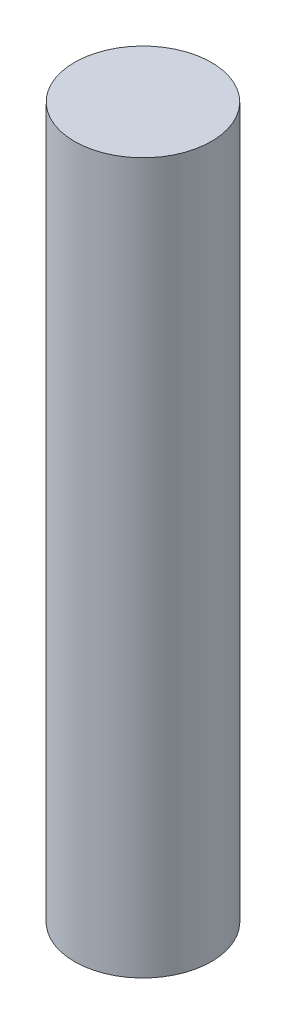
ISO-10303-21;
HEADER;
FILE_DESCRIPTION(('STEP AP214'),'2;1');
FILE_NAME('part.step','',(''),(''),'','','');
FILE_SCHEMA(('AUTOMOTIVE_DESIGN { 1 0 10303 214 1 1 1 1 }'));
ENDSEC;
DATA;
#1=APPLICATION_CONTEXT('core data for automotive mechanical design processes');
#2=APPLICATION_PROTOCOL_DEFINITION('international standard','automotive_design',2000,#1);
#3=PRODUCT_CONTEXT('',#1,'mechanical');
#4=PRODUCT('Part','Part','',(#3));
#5=PRODUCT_RELATED_PRODUCT_CATEGORY('part','',(#4));
#6=PRODUCT_DEFINITION_FORMATION('','',#4);
#7=PRODUCT_DEFINITION_CONTEXT('part definition',#1,'design');
#8=PRODUCT_DEFINITION('design','',#6,#7);
#9=PRODUCT_DEFINITION_SHAPE('','',#8);
#10=(LENGTH_UNIT() NAMED_UNIT(*) SI_UNIT(.MILLI.,.METRE.));
#11=(NAMED_UNIT(*) PLANE_ANGLE_UNIT() SI_UNIT($,.RADIAN.));
#12=(NAMED_UNIT(*) SI_UNIT($,.STERADIAN.) SOLID_ANGLE_UNIT());
#13=UNCERTAINTY_MEASURE_WITH_UNIT(LENGTH_MEASURE(1.E-05),#10,'distance_accuracy_value','');
#14=(GEOMETRIC_REPRESENTATION_CONTEXT(3) GLOBAL_UNCERTAINTY_ASSIGNED_CONTEXT((#13)) GLOBAL_UNIT_ASSIGNED_CONTEXT((#10,
#11,#12)) REPRESENTATION_CONTEXT('',''));
#15=CARTESIAN_POINT('',(0.,0.,0.));
#16=DIRECTION('',(0.,0.,1.));
#17=DIRECTION('',(1.,0.,0.));
#18=AXIS2_PLACEMENT_3D('',#15,#16,#17);
#19=CARTESIAN_POINT('',(0.,51.880000126,0.));
#20=DIRECTION('',(0.,-1.,0.));
#21=DIRECTION('',(0.,0.,-1.));
#22=AXIS2_PLACEMENT_3D('',#19,#20,#21);
#23=CYLINDRICAL_SURFACE('',#22,5.000000033);
#24=CARTESIAN_POINT('',(0.,51.880000126,0.));
#25=DIRECTION('',(0.,1.,0.));
#26=DIRECTION('',(0.,0.,1.));
#27=AXIS2_PLACEMENT_3D('',#24,#25,#26);
#28=CIRCLE('',#27,5.000000033);
#29=CARTESIAN_POINT('',(0.,51.880000126,5.000000033));
#30=VERTEX_POINT('',#29);
#31=EDGE_CURVE('E10',#30,#30,#28,.T.);
#32=ORIENTED_EDGE('',*,*,#31,.F.);
#33=EDGE_LOOP('',(#32));
#34=FACE_BOUND('',#33,.T.);
#35=CARTESIAN_POINT('',(0.,0.,0.));
#36=DIRECTION('',(0.,1.,0.));
#37=DIRECTION('',(0.,0.,1.));
#38=AXIS2_PLACEMENT_3D('',#35,#36,#37);
#39=CIRCLE('',#38,5.000000033);
#40=CARTESIAN_POINT('',(0.,0.,5.000000033));
#41=VERTEX_POINT('',#40);
#42=EDGE_CURVE('E37',#41,#41,#39,.T.);
#43=ORIENTED_EDGE('',*,*,#42,.T.);
#44=EDGE_LOOP('',(#43));
#45=FACE_BOUND('',#44,.T.);
#46=ADVANCED_FACE('F34',(#34,#45),#23,.T.);
#47=CARTESIAN_POINT('',(0.,51.880000126,0.));
#48=DIRECTION('',(0.,1.,0.));
#49=DIRECTION('',(0.,0.,1.));
#50=AXIS2_PLACEMENT_3D('',#47,#48,#49);
#51=PLANE('',#50);
#52=ORIENTED_EDGE('',*,*,#31,.T.);
#53=EDGE_LOOP('',(#52));
#54=FACE_BOUND('',#53,.T.);
#55=ADVANCED_FACE('F49',(#54),#51,.T.);
#56=CARTESIAN_POINT('',(0.,0.,0.));
#57=DIRECTION('',(0.,1.,0.));
#58=DIRECTION('',(0.,0.,1.));
#59=AXIS2_PLACEMENT_3D('',#56,#57,#58);
#60=PLANE('',#59);
#61=ORIENTED_EDGE('',*,*,#42,.F.);
#62=EDGE_LOOP('',(#61));
#63=FACE_BOUND('',#62,.T.);
#64=ADVANCED_FACE('F47',(#63),#60,.F.);
#65=CLOSED_SHELL('',(#46,#55,#64));
#66=MANIFOLD_SOLID_BREP('B2',#65);
#67=ADVANCED_BREP_SHAPE_REPRESENTATION('',(#18,#66),#14);
#68=SHAPE_DEFINITION_REPRESENTATION(#9,#67);
ENDSEC;
END-ISO-10303-21;
